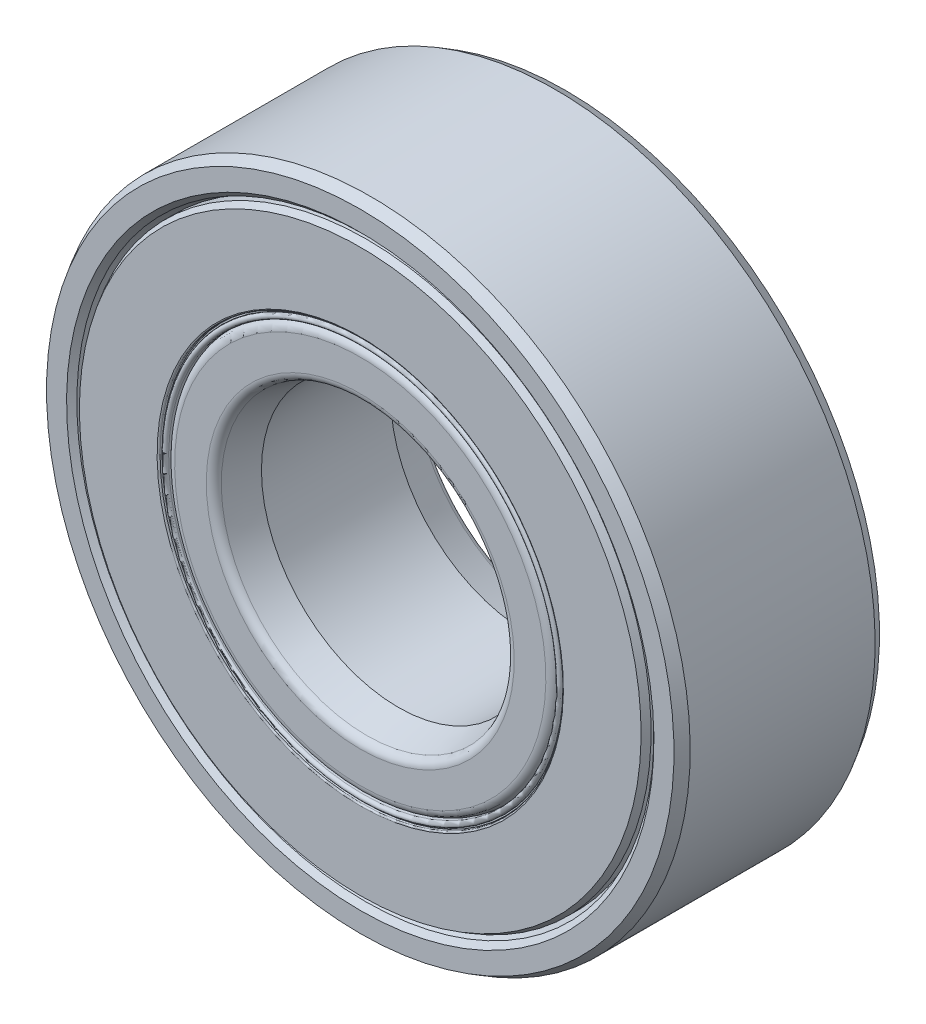
ISO-10303-21;
HEADER;
FILE_DESCRIPTION(('STEP AP214'),'2;1');
FILE_NAME('part.step','',(''),(''),'','','');
FILE_SCHEMA(('AUTOMOTIVE_DESIGN { 1 0 10303 214 1 1 1 1 }'));
ENDSEC;
DATA;
#1=APPLICATION_CONTEXT('core data for automotive mechanical design processes');
#2=APPLICATION_PROTOCOL_DEFINITION('international standard','automotive_design',2000,#1);
#3=PRODUCT_CONTEXT('',#1,'mechanical');
#4=PRODUCT('Part','Part','',(#3));
#5=PRODUCT_RELATED_PRODUCT_CATEGORY('part','',(#4));
#6=PRODUCT_DEFINITION_FORMATION('','',#4);
#7=PRODUCT_DEFINITION_CONTEXT('part definition',#1,'design');
#8=PRODUCT_DEFINITION('design','',#6,#7);
#9=PRODUCT_DEFINITION_SHAPE('','',#8);
#10=(LENGTH_UNIT() NAMED_UNIT(*) SI_UNIT(.MILLI.,.METRE.));
#11=(NAMED_UNIT(*) PLANE_ANGLE_UNIT() SI_UNIT($,.RADIAN.));
#12=(NAMED_UNIT(*) SI_UNIT($,.STERADIAN.) SOLID_ANGLE_UNIT());
#13=UNCERTAINTY_MEASURE_WITH_UNIT(LENGTH_MEASURE(1.E-05),#10,'distance_accuracy_value','');
#14=(GEOMETRIC_REPRESENTATION_CONTEXT(3) GLOBAL_UNCERTAINTY_ASSIGNED_CONTEXT((#13)) GLOBAL_UNIT_ASSIGNED_CONTEXT((#10,
#11,#12)) REPRESENTATION_CONTEXT('',''));
#15=CARTESIAN_POINT('',(0.,0.,0.));
#16=DIRECTION('',(0.,0.,1.));
#17=DIRECTION('',(1.,0.,0.));
#18=AXIS2_PLACEMENT_3D('',#15,#16,#17);
#19=CARTESIAN_POINT('',(0.,6.75745833333334,2.38125));
#20=DIRECTION('',(0.,0.,1.));
#21=DIRECTION('',(0.,-1.,0.));
#22=AXIS2_PLACEMENT_3D('',#19,#20,#21);
#23=PLANE('',#22);
#24=CARTESIAN_POINT('',(0.,0.,2.38125));
#25=DIRECTION('',(0.,0.,1.));
#26=DIRECTION('',(0.,-1.,0.));
#27=AXIS2_PLACEMENT_3D('',#24,#25,#26);
#28=CIRCLE('',#27,7.01145833333334);
#29=CARTESIAN_POINT('',(0.,-7.01145833333334,2.38125));
#30=VERTEX_POINT('',#29);
#31=EDGE_CURVE('E11',#30,#30,#28,.T.);
#32=ORIENTED_EDGE('',*,*,#31,.F.);
#33=EDGE_LOOP('',(#32));
#34=FACE_BOUND('',#33,.T.);
#35=CARTESIAN_POINT('',(0.,0.,2.38125));
#36=DIRECTION('',(0.,0.,1.));
#37=DIRECTION('',(0.,-1.,0.));
#38=AXIS2_PLACEMENT_3D('',#35,#36,#37);
#39=CIRCLE('',#38,6.75745833333334);
#40=CARTESIAN_POINT('',(0.,-6.75745833333334,2.38125));
#41=VERTEX_POINT('',#40);
#42=EDGE_CURVE('E76',#41,#41,#39,.T.);
#43=ORIENTED_EDGE('',*,*,#42,.T.);
#44=EDGE_LOOP('',(#43));
#45=FACE_BOUND('',#44,.T.);
#46=ADVANCED_FACE('F51',(#34,#45),#23,.F.);
#47=CARTESIAN_POINT('',(0.,0.,3.571875));
#48=DIRECTION('',(0.,0.,1.));
#49=DIRECTION('',(0.,-1.,0.));
#50=AXIS2_PLACEMENT_3D('',#47,#48,#49);
#51=CYLINDRICAL_SURFACE('',#50,7.01145833333334);
#52=CARTESIAN_POINT('',(0.,0.,3.3936805301339));
#53=DIRECTION('',(0.,0.,1.));
#54=DIRECTION('',(0.,-1.,0.));
#55=AXIS2_PLACEMENT_3D('',#52,#53,#54);
#56=CIRCLE('',#55,7.01145833333334);
#57=CARTESIAN_POINT('',(0.,-7.01145833333334,3.3936805301339));
#58=VERTEX_POINT('',#57);
#59=EDGE_CURVE('E57',#58,#58,#56,.T.);
#60=ORIENTED_EDGE('',*,*,#59,.F.);
#61=EDGE_LOOP('',(#60));
#62=FACE_BOUND('',#61,.T.);
#63=ORIENTED_EDGE('',*,*,#31,.T.);
#64=EDGE_LOOP('',(#63));
#65=FACE_BOUND('',#64,.T.);
#66=ADVANCED_FACE('F107',(#62,#65),#51,.T.);
#67=CARTESIAN_POINT('',(0.,0.,3.3936805301339));
#68=DIRECTION('',(0.,0.,-1.));
#69=DIRECTION('',(0.,1.,0.));
#70=AXIS2_PLACEMENT_3D('',#67,#68,#69);
#71=CONICAL_SURFACE('',#70,7.01145833333334,0.174532925199467);
#72=CARTESIAN_POINT('',(0.,0.,3.45621582245017));
#73=DIRECTION('',(0.,0.,1.));
#74=DIRECTION('',(0.,-1.,0.));
#75=AXIS2_PLACEMENT_3D('',#72,#73,#74);
#76=CIRCLE('',#75,7.00043167405148);
#77=CARTESIAN_POINT('',(0.,-7.00043167405148,3.45621582245017));
#78=VERTEX_POINT('',#77);
#79=EDGE_CURVE('E61',#78,#78,#76,.T.);
#80=ORIENTED_EDGE('',*,*,#79,.F.);
#81=EDGE_LOOP('',(#80));
#82=FACE_BOUND('',#81,.T.);
#83=ORIENTED_EDGE('',*,*,#59,.T.);
#84=EDGE_LOOP('',(#83));
#85=FACE_BOUND('',#84,.T.);
#86=ADVANCED_FACE('F102',(#82,#85),#71,.T.);
#87=CARTESIAN_POINT('',(0.,0.,3.451625));
#88=DIRECTION('',(0.,0.,1.));
#89=DIRECTION('',(0.,-1.,0.));
#90=AXIS2_PLACEMENT_3D('',#87,#88,#89);
#91=TOROIDAL_SURFACE('',#90,6.97439582615274,0.0264374928193996);
#92=CARTESIAN_POINT('',(0.,0.,3.451625));
#93=DIRECTION('',(0.,0.,1.));
#94=DIRECTION('',(0.,-1.,0.));
#95=AXIS2_PLACEMENT_3D('',#92,#93,#94);
#96=CIRCLE('',#95,6.94795833333334);
#97=CARTESIAN_POINT('',(0.,-6.94795833333334,3.451625));
#98=VERTEX_POINT('',#97);
#99=EDGE_CURVE('E65',#98,#98,#96,.T.);
#100=ORIENTED_EDGE('',*,*,#99,.F.);
#101=EDGE_LOOP('',(#100));
#102=FACE_BOUND('',#101,.T.);
#103=ORIENTED_EDGE('',*,*,#79,.T.);
#104=EDGE_LOOP('',(#103));
#105=FACE_BOUND('',#104,.T.);
#106=ADVANCED_FACE('F96',(#102,#105),#91,.T.);
#107=CARTESIAN_POINT('',(0.,0.,3.571875));
#108=DIRECTION('',(0.,0.,1.));
#109=DIRECTION('',(0.,-1.,0.));
#110=AXIS2_PLACEMENT_3D('',#107,#108,#109);
#111=CYLINDRICAL_SURFACE('',#110,6.94795833333334);
#112=CARTESIAN_POINT('',(0.,0.,3.476625));
#113=DIRECTION('',(0.,0.,1.));
#114=DIRECTION('',(0.,-1.,0.));
#115=AXIS2_PLACEMENT_3D('',#112,#113,#114);
#116=CIRCLE('',#115,6.94795833333334);
#117=CARTESIAN_POINT('',(0.,-6.94795833333334,3.476625));
#118=VERTEX_POINT('',#117);
#119=EDGE_CURVE('E70',#118,#118,#116,.T.);
#120=ORIENTED_EDGE('',*,*,#119,.F.);
#121=EDGE_LOOP('',(#120));
#122=FACE_BOUND('',#121,.T.);
#123=ORIENTED_EDGE('',*,*,#99,.T.);
#124=EDGE_LOOP('',(#123));
#125=FACE_BOUND('',#124,.T.);
#126=ADVANCED_FACE('F90',(#122,#125),#111,.T.);
#127=CARTESIAN_POINT('',(0.,0.,3.476625));
#128=DIRECTION('',(0.,0.,1.));
#129=DIRECTION('',(0.,-1.,0.));
#130=AXIS2_PLACEMENT_3D('',#127,#128,#129);
#131=TOROIDAL_SURFACE('',#130,6.85270833333334,0.0952499999999998);
#132=CARTESIAN_POINT('',(0.,0.,3.476625));
#133=DIRECTION('',(0.,0.,1.));
#134=DIRECTION('',(0.,-1.,0.));
#135=AXIS2_PLACEMENT_3D('',#132,#133,#134);
#136=CIRCLE('',#135,6.75745833333334);
#137=CARTESIAN_POINT('',(0.,-6.75745833333334,3.476625));
#138=VERTEX_POINT('',#137);
#139=EDGE_CURVE('E73',#138,#138,#136,.T.);
#140=ORIENTED_EDGE('',*,*,#139,.F.);
#141=EDGE_LOOP('',(#140));
#142=FACE_BOUND('',#141,.T.);
#143=ORIENTED_EDGE('',*,*,#119,.T.);
#144=EDGE_LOOP('',(#143));
#145=FACE_BOUND('',#144,.T.);
#146=ADVANCED_FACE('F84',(#142,#145),#131,.T.);
#147=CARTESIAN_POINT('',(0.,0.,3.571875));
#148=DIRECTION('',(0.,0.,1.));
#149=DIRECTION('',(0.,-1.,0.));
#150=AXIS2_PLACEMENT_3D('',#147,#148,#149);
#151=CYLINDRICAL_SURFACE('',#150,6.75745833333334);
#152=ORIENTED_EDGE('',*,*,#42,.F.);
#153=EDGE_LOOP('',(#152));
#154=FACE_BOUND('',#153,.T.);
#155=ORIENTED_EDGE('',*,*,#139,.T.);
#156=EDGE_LOOP('',(#155));
#157=FACE_BOUND('',#156,.T.);
#158=ADVANCED_FACE('F81',(#154,#157),#151,.F.);
#159=CLOSED_SHELL('',(#46,#66,#86,#106,#126,#146,#158));
#160=MANIFOLD_SOLID_BREP('B2',#159);
#161=CARTESIAN_POINT('',(0.,0.,-3.571875));
#162=DIRECTION('',(0.,0.,1.));
#163=DIRECTION('',(0.,-1.,0.));
#164=AXIS2_PLACEMENT_3D('',#161,#162,#163);
#165=CONICAL_SURFACE('',#164,9.763125,0.523598775598295);
#166=CARTESIAN_POINT('',(0.,0.,-3.35190454743876));
#167=DIRECTION('',(0.,0.,1.));
#168=DIRECTION('',(0.,-1.,0.));
#169=AXIS2_PLACEMENT_3D('',#166,#167,#168);
#170=CIRCLE('',#169,9.890125);
#171=CARTESIAN_POINT('',(0.,-9.890125,-3.35190454743876));
#172=VERTEX_POINT('',#171);
#173=EDGE_CURVE('E187',#172,#172,#170,.T.);
#174=ORIENTED_EDGE('',*,*,#173,.F.);
#175=EDGE_LOOP('',(#174));
#176=FACE_BOUND('',#175,.T.);
#177=CARTESIAN_POINT('',(0.,0.,-3.571875));
#178=DIRECTION('',(0.,0.,1.));
#179=DIRECTION('',(0.,-1.,0.));
#180=AXIS2_PLACEMENT_3D('',#177,#178,#179);
#181=CIRCLE('',#180,9.763125);
#182=CARTESIAN_POINT('',(0.,-9.763125,-3.57187500000001));
#183=VERTEX_POINT('',#182);
#184=EDGE_CURVE('E50',#183,#183,#181,.T.);
#185=ORIENTED_EDGE('',*,*,#184,.T.);
#186=EDGE_LOOP('',(#185));
#187=FACE_BOUND('',#186,.T.);
#188=ADVANCED_FACE('F165',(#176,#187),#165,.T.);
#189=CARTESIAN_POINT('',(0.,9.763125,-3.571875));
#190=DIRECTION('',(0.,0.,1.));
#191=DIRECTION('',(0.,-1.,0.));
#192=AXIS2_PLACEMENT_3D('',#189,#190,#191);
#193=PLANE('',#192);
#194=ORIENTED_EDGE('',*,*,#184,.F.);
#195=EDGE_LOOP('',(#194));
#196=FACE_BOUND('',#195,.T.);
#197=CARTESIAN_POINT('',(0.,0.,-3.57187500000001));
#198=DIRECTION('',(0.,0.,1.));
#199=DIRECTION('',(0.,-1.,0.));
#200=AXIS2_PLACEMENT_3D('',#197,#198,#199);
#201=CIRCLE('',#200,7.06225833333334);
#202=CARTESIAN_POINT('',(0.,-7.06225833333333,-3.57187500000001));
#203=VERTEX_POINT('',#202);
#204=EDGE_CURVE('E171',#203,#203,#201,.T.);
#205=ORIENTED_EDGE('',*,*,#204,.T.);
#206=EDGE_LOOP('',(#205));
#207=FACE_BOUND('',#206,.T.);
#208=ADVANCED_FACE('F194',(#196,#207),#193,.F.);
#209=CARTESIAN_POINT('',(0.,0.,-3.521075));
#210=DIRECTION('',(0.,0.,1.));
#211=DIRECTION('',(0.,-1.,0.));
#212=AXIS2_PLACEMENT_3D('',#209,#210,#211);
#213=TOROIDAL_SURFACE('',#212,7.06225833333334,0.0508000000000004);
#214=ORIENTED_EDGE('',*,*,#204,.F.);
#215=EDGE_LOOP('',(#214));
#216=FACE_BOUND('',#215,.T.);
#217=CARTESIAN_POINT('',(0.,0.,-3.521075));
#218=DIRECTION('',(0.,0.,1.));
#219=DIRECTION('',(0.,-1.,0.));
#220=AXIS2_PLACEMENT_3D('',#217,#218,#219);
#221=CIRCLE('',#220,7.01145833333333);
#222=CARTESIAN_POINT('',(0.,-7.01145833333333,-3.52107500000001));
#223=VERTEX_POINT('',#222);
#224=EDGE_CURVE('E175',#223,#223,#221,.T.);
#225=ORIENTED_EDGE('',*,*,#224,.T.);
#226=EDGE_LOOP('',(#225));
#227=FACE_BOUND('',#226,.T.);
#228=ADVANCED_FACE('F198',(#216,#227),#213,.T.);
#229=CARTESIAN_POINT('',(0.,0.,3.571875));
#230=DIRECTION('',(0.,0.,1.));
#231=DIRECTION('',(0.,-1.,0.));
#232=AXIS2_PLACEMENT_3D('',#229,#230,#231);
#233=CYLINDRICAL_SURFACE('',#232,7.01145833333333);
#234=ORIENTED_EDGE('',*,*,#224,.F.);
#235=EDGE_LOOP('',(#234));
#236=FACE_BOUND('',#235,.T.);
#237=CARTESIAN_POINT('',(0.,0.,-2.38125));
#238=DIRECTION('',(0.,0.,1.));
#239=DIRECTION('',(0.,-1.,0.));
#240=AXIS2_PLACEMENT_3D('',#237,#238,#239);
#241=CIRCLE('',#240,7.01145833333334);
#242=CARTESIAN_POINT('',(0.,-7.01145833333333,-2.38125));
#243=VERTEX_POINT('',#242);
#244=EDGE_CURVE('E179',#243,#243,#241,.T.);
#245=ORIENTED_EDGE('',*,*,#244,.T.);
#246=EDGE_LOOP('',(#245));
#247=FACE_BOUND('',#246,.T.);
#248=ADVANCED_FACE('F203',(#236,#247),#233,.F.);
#249=CARTESIAN_POINT('',(0.,9.890125,-2.38125));
#250=DIRECTION('',(0.,0.,-1.));
#251=DIRECTION('',(0.,1.,0.));
#252=AXIS2_PLACEMENT_3D('',#249,#250,#251);
#253=PLANE('',#252);
#254=ORIENTED_EDGE('',*,*,#244,.F.);
#255=EDGE_LOOP('',(#254));
#256=FACE_BOUND('',#255,.T.);
#257=CARTESIAN_POINT('',(0.,0.,-2.38125));
#258=DIRECTION('',(0.,0.,1.));
#259=DIRECTION('',(0.,-1.,0.));
#260=AXIS2_PLACEMENT_3D('',#257,#258,#259);
#261=CIRCLE('',#260,9.890125);
#262=CARTESIAN_POINT('',(0.,-9.890125,-2.38125));
#263=VERTEX_POINT('',#262);
#264=EDGE_CURVE('E184',#263,#263,#261,.T.);
#265=ORIENTED_EDGE('',*,*,#264,.T.);
#266=EDGE_LOOP('',(#265));
#267=FACE_BOUND('',#266,.T.);
#268=ADVANCED_FACE('F209',(#256,#267),#253,.F.);
#269=CARTESIAN_POINT('',(0.,0.,3.571875));
#270=DIRECTION('',(0.,0.,1.));
#271=DIRECTION('',(0.,-1.,0.));
#272=AXIS2_PLACEMENT_3D('',#269,#270,#271);
#273=CYLINDRICAL_SURFACE('',#272,9.890125);
#274=ORIENTED_EDGE('',*,*,#264,.F.);
#275=EDGE_LOOP('',(#274));
#276=FACE_BOUND('',#275,.T.);
#277=ORIENTED_EDGE('',*,*,#173,.T.);
#278=EDGE_LOOP('',(#277));
#279=FACE_BOUND('',#278,.T.);
#280=ADVANCED_FACE('F191',(#276,#279),#273,.T.);
#281=CLOSED_SHELL('',(#188,#208,#228,#248,#268,#280));
#282=MANIFOLD_SOLID_BREP('B6',#281);
#283=CARTESIAN_POINT('',(0.,9.890125,2.38125));
#284=DIRECTION('',(0.,0.,1.));
#285=DIRECTION('',(0.,-1.,0.));
#286=AXIS2_PLACEMENT_3D('',#283,#284,#285);
#287=PLANE('',#286);
#288=CARTESIAN_POINT('',(0.,0.,2.38125));
#289=DIRECTION('',(0.,0.,1.));
#290=DIRECTION('',(0.,-1.,0.));
#291=AXIS2_PLACEMENT_3D('',#288,#289,#290);
#292=CIRCLE('',#291,9.890125);
#293=CARTESIAN_POINT('',(0.,-9.890125,2.38125));
#294=VERTEX_POINT('',#293);
#295=EDGE_CURVE('E164',#294,#294,#292,.T.);
#296=ORIENTED_EDGE('',*,*,#295,.F.);
#297=EDGE_LOOP('',(#296));
#298=FACE_BOUND('',#297,.T.);
#299=CARTESIAN_POINT('',(0.,0.,2.38125));
#300=DIRECTION('',(0.,0.,1.));
#301=DIRECTION('',(0.,-1.,0.));
#302=AXIS2_PLACEMENT_3D('',#299,#300,#301);
#303=CIRCLE('',#302,7.01145833333334);
#304=CARTESIAN_POINT('',(0.,-7.01145833333334,2.38125));
#305=VERTEX_POINT('',#304);
#306=EDGE_CURVE('E284',#305,#305,#303,.T.);
#307=ORIENTED_EDGE('',*,*,#306,.T.);
#308=EDGE_LOOP('',(#307));
#309=FACE_BOUND('',#308,.T.);
#310=ADVANCED_FACE('F262',(#298,#309),#287,.F.);
#311=CARTESIAN_POINT('',(0.,0.,3.571875));
#312=DIRECTION('',(0.,0.,1.));
#313=DIRECTION('',(0.,-1.,0.));
#314=AXIS2_PLACEMENT_3D('',#311,#312,#313);
#315=CYLINDRICAL_SURFACE('',#314,9.890125);
#316=CARTESIAN_POINT('',(0.,0.,3.35190454743875));
#317=DIRECTION('',(0.,0.,1.));
#318=DIRECTION('',(0.,-1.,0.));
#319=AXIS2_PLACEMENT_3D('',#316,#317,#318);
#320=CIRCLE('',#319,9.890125);
#321=CARTESIAN_POINT('',(0.,-9.890125,3.35190454743875));
#322=VERTEX_POINT('',#321);
#323=EDGE_CURVE('E268',#322,#322,#320,.T.);
#324=ORIENTED_EDGE('',*,*,#323,.F.);
#325=EDGE_LOOP('',(#324));
#326=FACE_BOUND('',#325,.T.);
#327=ORIENTED_EDGE('',*,*,#295,.T.);
#328=EDGE_LOOP('',(#327));
#329=FACE_BOUND('',#328,.T.);
#330=ADVANCED_FACE('F309',(#326,#329),#315,.T.);
#331=CARTESIAN_POINT('',(0.,0.,3.35190454743875));
#332=DIRECTION('',(0.,0.,-1.));
#333=DIRECTION('',(0.,1.,0.));
#334=AXIS2_PLACEMENT_3D('',#331,#332,#333);
#335=CONICAL_SURFACE('',#334,9.890125,0.523598775598299);
#336=CARTESIAN_POINT('',(0.,0.,3.571875));
#337=DIRECTION('',(0.,0.,1.));
#338=DIRECTION('',(0.,-1.,0.));
#339=AXIS2_PLACEMENT_3D('',#336,#337,#338);
#340=CIRCLE('',#339,9.763125);
#341=CARTESIAN_POINT('',(0.,-9.763125,3.571875));
#342=VERTEX_POINT('',#341);
#343=EDGE_CURVE('E272',#342,#342,#340,.T.);
#344=ORIENTED_EDGE('',*,*,#343,.F.);
#345=EDGE_LOOP('',(#344));
#346=FACE_BOUND('',#345,.T.);
#347=ORIENTED_EDGE('',*,*,#323,.T.);
#348=EDGE_LOOP('',(#347));
#349=FACE_BOUND('',#348,.T.);
#350=ADVANCED_FACE('F304',(#346,#349),#335,.T.);
#351=CARTESIAN_POINT('',(0.,9.763125,3.571875));
#352=DIRECTION('',(0.,0.,-1.));
#353=DIRECTION('',(0.,1.,0.));
#354=AXIS2_PLACEMENT_3D('',#351,#352,#353);
#355=PLANE('',#354);
#356=CARTESIAN_POINT('',(0.,0.,3.571875));
#357=DIRECTION('',(0.,0.,1.));
#358=DIRECTION('',(0.,-1.,0.));
#359=AXIS2_PLACEMENT_3D('',#356,#357,#358);
#360=CIRCLE('',#359,7.06225833333334);
#361=CARTESIAN_POINT('',(0.,-7.06225833333334,3.571875));
#362=VERTEX_POINT('',#361);
#363=EDGE_CURVE('E276',#362,#362,#360,.T.);
#364=ORIENTED_EDGE('',*,*,#363,.F.);
#365=EDGE_LOOP('',(#364));
#366=FACE_BOUND('',#365,.T.);
#367=ORIENTED_EDGE('',*,*,#343,.T.);
#368=EDGE_LOOP('',(#367));
#369=FACE_BOUND('',#368,.T.);
#370=ADVANCED_FACE('F298',(#366,#369),#355,.F.);
#371=CARTESIAN_POINT('',(0.,0.,3.521075));
#372=DIRECTION('',(0.,0.,1.));
#373=DIRECTION('',(0.,-1.,0.));
#374=AXIS2_PLACEMENT_3D('',#371,#372,#373);
#375=TOROIDAL_SURFACE('',#374,7.06225833333334,0.0508000000000004);
#376=CARTESIAN_POINT('',(0.,0.,3.521075));
#377=DIRECTION('',(0.,0.,1.));
#378=DIRECTION('',(0.,-1.,0.));
#379=AXIS2_PLACEMENT_3D('',#376,#377,#378);
#380=CIRCLE('',#379,7.01145833333334);
#381=CARTESIAN_POINT('',(0.,-7.01145833333334,3.521075));
#382=VERTEX_POINT('',#381);
#383=EDGE_CURVE('E281',#382,#382,#380,.T.);
#384=ORIENTED_EDGE('',*,*,#383,.F.);
#385=EDGE_LOOP('',(#384));
#386=FACE_BOUND('',#385,.T.);
#387=ORIENTED_EDGE('',*,*,#363,.T.);
#388=EDGE_LOOP('',(#387));
#389=FACE_BOUND('',#388,.T.);
#390=ADVANCED_FACE('F292',(#386,#389),#375,.T.);
#391=CARTESIAN_POINT('',(0.,0.,3.571875));
#392=DIRECTION('',(0.,0.,1.));
#393=DIRECTION('',(0.,-1.,0.));
#394=AXIS2_PLACEMENT_3D('',#391,#392,#393);
#395=CYLINDRICAL_SURFACE('',#394,7.01145833333334);
#396=ORIENTED_EDGE('',*,*,#306,.F.);
#397=EDGE_LOOP('',(#396));
#398=FACE_BOUND('',#397,.T.);
#399=ORIENTED_EDGE('',*,*,#383,.T.);
#400=EDGE_LOOP('',(#399));
#401=FACE_BOUND('',#400,.T.);
#402=ADVANCED_FACE('F289',(#398,#401),#395,.F.);
#403=CLOSED_SHELL('',(#310,#330,#350,#370,#390,#402));
#404=MANIFOLD_SOLID_BREP('B45',#403);
#405=CARTESIAN_POINT('',(-5.885809532684,5.88580953268415,0.));
#406=DIRECTION('',(0.,0.,1.));
#407=DIRECTION('',(-0.707106781186539,0.707106781186556,0.));
#408=AXIS2_PLACEMENT_3D('',#405,#406,#407);
#409=SPHERICAL_SURFACE('',#408,2.38125);
#410=CARTESIAN_POINT('',(-5.885809532684,5.88580953268415,2.38125));
#411=VERTEX_POINT('',#410);
#412=VERTEX_LOOP('',#411);
#413=FACE_BOUND('',#412,.T.);
#414=ADVANCED_FACE('F381',(#413),#409,.T.);
#415=CLOSED_SHELL('',(#414));
#416=MANIFOLD_SOLID_BREP('B159',#415);
#417=CARTESIAN_POINT('',(-8.32379166666667,0.,0.));
#418=DIRECTION('',(0.,0.,1.));
#419=DIRECTION('',(-1.,0.,0.));
#420=AXIS2_PLACEMENT_3D('',#417,#418,#419);
#421=SPHERICAL_SURFACE('',#420,2.38125);
#422=CARTESIAN_POINT('',(-8.32379166666667,0.,2.38125));
#423=VERTEX_POINT('',#422);
#424=VERTEX_LOOP('',#423);
#425=FACE_BOUND('',#424,.T.);
#426=ADVANCED_FACE('F399',(#425),#421,.T.);
#427=CLOSED_SHELL('',(#426));
#428=MANIFOLD_SOLID_BREP('B258',#427);
#429=CARTESIAN_POINT('',(-5.88580953268413,-5.88580953268402,0.));
#430=DIRECTION('',(0.,0.,1.));
#431=DIRECTION('',(-0.707106781186554,-0.707106781186541,0.));
#432=AXIS2_PLACEMENT_3D('',#429,#430,#431);
#433=SPHERICAL_SURFACE('',#432,2.38125);
#434=CARTESIAN_POINT('',(-5.88580953268413,-5.88580953268402,2.38125));
#435=VERTEX_POINT('',#434);
#436=VERTEX_LOOP('',#435);
#437=FACE_BOUND('',#436,.T.);
#438=ADVANCED_FACE('F417',(#437),#433,.T.);
#439=CLOSED_SHELL('',(#438));
#440=MANIFOLD_SOLID_BREP('B377',#439);
#441=CARTESIAN_POINT('',(0.,-8.32379166666667,0.));
#442=DIRECTION('',(0.,0.,1.));
#443=DIRECTION('',(0.,-1.,0.));
#444=AXIS2_PLACEMENT_3D('',#441,#442,#443);
#445=SPHERICAL_SURFACE('',#444,2.38125);
#446=CARTESIAN_POINT('',(0.,-8.32379166666667,2.38124999999999));
#447=VERTEX_POINT('',#446);
#448=VERTEX_LOOP('',#447);
#449=FACE_BOUND('',#448,.T.);
#450=ADVANCED_FACE('F435',(#449),#445,.T.);
#451=CLOSED_SHELL('',(#450));
#452=MANIFOLD_SOLID_BREP('B395',#451);
#453=CARTESIAN_POINT('',(5.88580953268404,-5.88580953268411,0.));
#454=DIRECTION('',(0.,0.,1.));
#455=DIRECTION('',(0.707106781186544,-0.707106781186551,0.));
#456=AXIS2_PLACEMENT_3D('',#453,#454,#455);
#457=SPHERICAL_SURFACE('',#456,2.38125);
#458=CARTESIAN_POINT('',(5.88580953268404,-5.88580953268411,2.38125));
#459=VERTEX_POINT('',#458);
#460=VERTEX_LOOP('',#459);
#461=FACE_BOUND('',#460,.T.);
#462=ADVANCED_FACE('F453',(#461),#457,.T.);
#463=CLOSED_SHELL('',(#462));
#464=MANIFOLD_SOLID_BREP('B413',#463);
#465=CARTESIAN_POINT('',(8.32379166666667,0.,0.));
#466=DIRECTION('',(0.,0.,1.));
#467=DIRECTION('',(1.,0.,0.));
#468=AXIS2_PLACEMENT_3D('',#465,#466,#467);
#469=SPHERICAL_SURFACE('',#468,2.38125);
#470=CARTESIAN_POINT('',(8.32379166666667,0.,2.38125));
#471=VERTEX_POINT('',#470);
#472=VERTEX_LOOP('',#471);
#473=FACE_BOUND('',#472,.T.);
#474=ADVANCED_FACE('F471',(#473),#469,.T.);
#475=CLOSED_SHELL('',(#474));
#476=MANIFOLD_SOLID_BREP('B431',#475);
#477=CARTESIAN_POINT('',(5.88580953268408,5.88580953268406,0.));
#478=DIRECTION('',(0.,0.,1.));
#479=DIRECTION('',(0.707106781186549,0.707106781186546,0.));
#480=AXIS2_PLACEMENT_3D('',#477,#478,#479);
#481=SPHERICAL_SURFACE('',#480,2.38125);
#482=CARTESIAN_POINT('',(5.88580953268408,5.88580953268406,2.38125));
#483=VERTEX_POINT('',#482);
#484=VERTEX_LOOP('',#483);
#485=FACE_BOUND('',#484,.T.);
#486=ADVANCED_FACE('F489',(#485),#481,.T.);
#487=CLOSED_SHELL('',(#486));
#488=MANIFOLD_SOLID_BREP('B449',#487);
#489=CARTESIAN_POINT('',(0.,8.32379166666667,0.));
#490=DIRECTION('',(0.,0.,1.));
#491=DIRECTION('',(0.,1.,0.));
#492=AXIS2_PLACEMENT_3D('',#489,#490,#491);
#493=SPHERICAL_SURFACE('',#492,2.38125);
#494=CARTESIAN_POINT('',(0.,8.32379166666667,2.38125));
#495=VERTEX_POINT('',#494);
#496=VERTEX_LOOP('',#495);
#497=FACE_BOUND('',#496,.T.);
#498=ADVANCED_FACE('F509',(#497),#493,.T.);
#499=CLOSED_SHELL('',(#498));
#500=MANIFOLD_SOLID_BREP('B467',#499);
#501=CARTESIAN_POINT('',(0.,0.,-3.26645774265215));
#502=DIRECTION('',(0.,0.,1.));
#503=DIRECTION('',(0.,-1.,0.));
#504=AXIS2_PLACEMENT_3D('',#501,#502,#503);
#505=TOROIDAL_SURFACE('',#504,5.35252083333333,0.305417257347854);
#506=CARTESIAN_POINT('',(0.,0.,-3.571875));
#507=DIRECTION('',(0.,0.,1.));
#508=DIRECTION('',(0.,-1.,0.));
#509=AXIS2_PLACEMENT_3D('',#506,#507,#508);
#510=CIRCLE('',#509,5.35252083333333);
#511=CARTESIAN_POINT('',(0.,-5.35252083333333,-3.571875));
#512=VERTEX_POINT('',#511);
#513=EDGE_CURVE('E508',#512,#512,#510,.T.);
#514=ORIENTED_EDGE('',*,*,#513,.F.);
#515=EDGE_LOOP('',(#514));
#516=FACE_BOUND('',#515,.T.);
#517=CARTESIAN_POINT('',(0.,0.,-3.34550554555675));
#518=DIRECTION('',(0.,0.,1.));
#519=DIRECTION('',(0.,-1.,0.));
#520=AXIS2_PLACEMENT_3D('',#517,#518,#519);
#521=CIRCLE('',#520,5.05751041666667);
#522=CARTESIAN_POINT('',(0.,-5.05751041666667,-3.34550554555675));
#523=VERTEX_POINT('',#522);
#524=EDGE_CURVE('E568',#523,#523,#521,.T.);
#525=ORIENTED_EDGE('',*,*,#524,.T.);
#526=EDGE_LOOP('',(#525));
#527=FACE_BOUND('',#526,.T.);
#528=ADVANCED_FACE('F528',(#516,#527),#505,.T.);
#529=CARTESIAN_POINT('',(0.,5.35252083333333,-3.571875));
#530=DIRECTION('',(0.,0.,1.));
#531=DIRECTION('',(0.,-1.,0.));
#532=AXIS2_PLACEMENT_3D('',#529,#530,#531);
#533=PLANE('',#532);
#534=CARTESIAN_POINT('',(0.,0.,-3.571875));
#535=DIRECTION('',(0.,0.,1.));
#536=DIRECTION('',(0.,-1.,0.));
#537=AXIS2_PLACEMENT_3D('',#534,#535,#536);
#538=CIRCLE('',#537,6.45204107598548);
#539=CARTESIAN_POINT('',(0.,-6.45204107598548,-3.571875));
#540=VERTEX_POINT('',#539);
#541=EDGE_CURVE('E534',#540,#540,#538,.T.);
#542=ORIENTED_EDGE('',*,*,#541,.F.);
#543=EDGE_LOOP('',(#542));
#544=FACE_BOUND('',#543,.T.);
#545=ORIENTED_EDGE('',*,*,#513,.T.);
#546=EDGE_LOOP('',(#545));
#547=FACE_BOUND('',#546,.T.);
#548=ADVANCED_FACE('F629',(#544,#547),#533,.F.);
#549=CARTESIAN_POINT('',(0.,0.,-3.26645774265215));
#550=DIRECTION('',(0.,0.,1.));
#551=DIRECTION('',(0.,-1.,0.));
#552=AXIS2_PLACEMENT_3D('',#549,#550,#551);
#553=TOROIDAL_SURFACE('',#552,6.45204107598548,0.305417257347853);
#554=CARTESIAN_POINT('',(0.,0.,-3.26645774265215));
#555=DIRECTION('',(0.,0.,1.));
#556=DIRECTION('',(0.,-1.,0.));
#557=AXIS2_PLACEMENT_3D('',#554,#555,#556);
#558=CIRCLE('',#557,6.75745833333333);
#559=CARTESIAN_POINT('',(0.,-6.75745833333333,-3.26645774265215));
#560=VERTEX_POINT('',#559);
#561=EDGE_CURVE('E538',#560,#560,#558,.T.);
#562=ORIENTED_EDGE('',*,*,#561,.F.);
#563=EDGE_LOOP('',(#562));
#564=FACE_BOUND('',#563,.T.);
#565=ORIENTED_EDGE('',*,*,#541,.T.);
#566=EDGE_LOOP('',(#565));
#567=FACE_BOUND('',#566,.T.);
#568=ADVANCED_FACE('F624',(#564,#567),#553,.T.);
#569=CARTESIAN_POINT('',(0.,0.,3.571875));
#570=DIRECTION('',(0.,0.,1.));
#571=DIRECTION('',(0.,-1.,0.));
#572=AXIS2_PLACEMENT_3D('',#569,#570,#571);
#573=CYLINDRICAL_SURFACE('',#572,6.75745833333334);
#574=CARTESIAN_POINT('',(0.,0.,-1.79358619848306));
#575=DIRECTION('',(0.,0.,1.));
#576=DIRECTION('',(0.,-1.,0.));
#577=AXIS2_PLACEMENT_3D('',#574,#575,#576);
#578=CIRCLE('',#577,6.75745833333334);
#579=CARTESIAN_POINT('',(0.,-6.75745833333334,-1.79358619848306));
#580=VERTEX_POINT('',#579);
#581=EDGE_CURVE('E542',#580,#580,#578,.T.);
#582=ORIENTED_EDGE('',*,*,#581,.F.);
#583=EDGE_LOOP('',(#582));
#584=FACE_BOUND('',#583,.T.);
#585=ORIENTED_EDGE('',*,*,#561,.T.);
#586=EDGE_LOOP('',(#585));
#587=FACE_BOUND('',#586,.T.);
#588=ADVANCED_FACE('F618',(#584,#587),#573,.T.);
#589=CARTESIAN_POINT('',(0.,0.,0.));
#590=DIRECTION('',(0.,0.,1.));
#591=DIRECTION('',(0.,-1.,0.));
#592=AXIS2_PLACEMENT_3D('',#589,#590,#591);
#593=TOROIDAL_SURFACE('',#592,8.32379166666667,2.38125);
#594=CARTESIAN_POINT('',(0.,0.,1.79358619848305));
#595=DIRECTION('',(0.,0.,1.));
#596=DIRECTION('',(0.,-1.,0.));
#597=AXIS2_PLACEMENT_3D('',#594,#595,#596);
#598=CIRCLE('',#597,6.75745833333334);
#599=CARTESIAN_POINT('',(0.,-6.75745833333334,1.79358619848305));
#600=VERTEX_POINT('',#599);
#601=EDGE_CURVE('E547',#600,#600,#598,.T.);
#602=ORIENTED_EDGE('',*,*,#601,.F.);
#603=EDGE_LOOP('',(#602));
#604=FACE_BOUND('',#603,.T.);
#605=ORIENTED_EDGE('',*,*,#581,.T.);
#606=EDGE_LOOP('',(#605));
#607=FACE_BOUND('',#606,.T.);
#608=ADVANCED_FACE('F612',(#604,#607),#593,.F.);
#609=CARTESIAN_POINT('',(0.,0.,3.571875));
#610=DIRECTION('',(0.,0.,1.));
#611=DIRECTION('',(0.,-1.,0.));
#612=AXIS2_PLACEMENT_3D('',#609,#610,#611);
#613=CYLINDRICAL_SURFACE('',#612,6.75745833333334);
#614=CARTESIAN_POINT('',(0.,0.,3.26645774265215));
#615=DIRECTION('',(0.,0.,1.));
#616=DIRECTION('',(0.,-1.,0.));
#617=AXIS2_PLACEMENT_3D('',#614,#615,#616);
#618=CIRCLE('',#617,6.75745833333334);
#619=CARTESIAN_POINT('',(0.,-6.75745833333334,3.26645774265215));
#620=VERTEX_POINT('',#619);
#621=EDGE_CURVE('E550',#620,#620,#618,.T.);
#622=ORIENTED_EDGE('',*,*,#621,.F.);
#623=EDGE_LOOP('',(#622));
#624=FACE_BOUND('',#623,.T.);
#625=ORIENTED_EDGE('',*,*,#601,.T.);
#626=EDGE_LOOP('',(#625));
#627=FACE_BOUND('',#626,.T.);
#628=ADVANCED_FACE('F606',(#624,#627),#613,.T.);
#629=CARTESIAN_POINT('',(0.,0.,3.26645774265215));
#630=DIRECTION('',(0.,0.,1.));
#631=DIRECTION('',(0.,-1.,0.));
#632=AXIS2_PLACEMENT_3D('',#629,#630,#631);
#633=TOROIDAL_SURFACE('',#632,6.45204107598548,0.305417257347853);
#634=CARTESIAN_POINT('',(0.,0.,3.571875));
#635=DIRECTION('',(0.,0.,1.));
#636=DIRECTION('',(0.,-1.,0.));
#637=AXIS2_PLACEMENT_3D('',#634,#635,#636);
#638=CIRCLE('',#637,6.45204107598548);
#639=CARTESIAN_POINT('',(0.,-6.45204107598548,3.571875));
#640=VERTEX_POINT('',#639);
#641=EDGE_CURVE('E553',#640,#640,#638,.T.);
#642=ORIENTED_EDGE('',*,*,#641,.F.);
#643=EDGE_LOOP('',(#642));
#644=FACE_BOUND('',#643,.T.);
#645=ORIENTED_EDGE('',*,*,#621,.T.);
#646=EDGE_LOOP('',(#645));
#647=FACE_BOUND('',#646,.T.);
#648=ADVANCED_FACE('F600',(#644,#647),#633,.T.);
#649=CARTESIAN_POINT('',(0.,5.35252083333333,3.571875));
#650=DIRECTION('',(0.,0.,-1.));
#651=DIRECTION('',(0.,1.,0.));
#652=AXIS2_PLACEMENT_3D('',#649,#650,#651);
#653=PLANE('',#652);
#654=CARTESIAN_POINT('',(0.,0.,3.571875));
#655=DIRECTION('',(0.,0.,1.));
#656=DIRECTION('',(0.,-1.,0.));
#657=AXIS2_PLACEMENT_3D('',#654,#655,#656);
#658=CIRCLE('',#657,5.35252083333333);
#659=CARTESIAN_POINT('',(0.,-5.35252083333333,3.571875));
#660=VERTEX_POINT('',#659);
#661=EDGE_CURVE('E556',#660,#660,#658,.T.);
#662=ORIENTED_EDGE('',*,*,#661,.F.);
#663=EDGE_LOOP('',(#662));
#664=FACE_BOUND('',#663,.T.);
#665=ORIENTED_EDGE('',*,*,#641,.T.);
#666=EDGE_LOOP('',(#665));
#667=FACE_BOUND('',#666,.T.);
#668=ADVANCED_FACE('F594',(#664,#667),#653,.F.);
#669=CARTESIAN_POINT('',(0.,0.,3.26645774265215));
#670=DIRECTION('',(0.,0.,1.));
#671=DIRECTION('',(0.,-1.,0.));
#672=AXIS2_PLACEMENT_3D('',#669,#670,#671);
#673=TOROIDAL_SURFACE('',#672,5.35252083333333,0.305417257347854);
#674=CARTESIAN_POINT('',(0.,0.,3.34550554555675));
#675=DIRECTION('',(0.,0.,1.));
#676=DIRECTION('',(0.,-1.,0.));
#677=AXIS2_PLACEMENT_3D('',#674,#675,#676);
#678=CIRCLE('',#677,5.05751041666667);
#679=CARTESIAN_POINT('',(0.,-5.05751041666667,3.34550554555675));
#680=VERTEX_POINT('',#679);
#681=EDGE_CURVE('E559',#680,#680,#678,.T.);
#682=ORIENTED_EDGE('',*,*,#681,.F.);
#683=EDGE_LOOP('',(#682));
#684=FACE_BOUND('',#683,.T.);
#685=ORIENTED_EDGE('',*,*,#661,.T.);
#686=EDGE_LOOP('',(#685));
#687=FACE_BOUND('',#686,.T.);
#688=ADVANCED_FACE('F588',(#684,#687),#673,.T.);
#689=CARTESIAN_POINT('',(0.,0.,3.34550554555675));
#690=DIRECTION('',(0.,0.,1.));
#691=DIRECTION('',(0.,-1.,0.));
#692=AXIS2_PLACEMENT_3D('',#689,#690,#691);
#693=CONICAL_SURFACE('',#692,5.05751041666667,0.26179938779915);
#694=CARTESIAN_POINT('',(0.,0.,2.24451168179469));
#695=DIRECTION('',(0.,0.,1.));
#696=DIRECTION('',(0.,-1.,0.));
#697=AXIS2_PLACEMENT_3D('',#694,#695,#696);
#698=CIRCLE('',#697,4.7625);
#699=CARTESIAN_POINT('',(0.,-4.7625,2.24451168179469));
#700=VERTEX_POINT('',#699);
#701=EDGE_CURVE('E562',#700,#700,#698,.T.);
#702=ORIENTED_EDGE('',*,*,#701,.F.);
#703=EDGE_LOOP('',(#702));
#704=FACE_BOUND('',#703,.T.);
#705=ORIENTED_EDGE('',*,*,#681,.T.);
#706=EDGE_LOOP('',(#705));
#707=FACE_BOUND('',#706,.T.);
#708=ADVANCED_FACE('F582',(#704,#707),#693,.F.);
#709=CARTESIAN_POINT('',(0.,0.,3.571875));
#710=DIRECTION('',(0.,0.,1.));
#711=DIRECTION('',(0.,-1.,0.));
#712=AXIS2_PLACEMENT_3D('',#709,#710,#711);
#713=CYLINDRICAL_SURFACE('',#712,4.7625);
#714=CARTESIAN_POINT('',(0.,0.,-2.24451168179469));
#715=DIRECTION('',(0.,0.,1.));
#716=DIRECTION('',(0.,-1.,0.));
#717=AXIS2_PLACEMENT_3D('',#714,#715,#716);
#718=CIRCLE('',#717,4.7625);
#719=CARTESIAN_POINT('',(0.,-4.7625,-2.24451168179469));
#720=VERTEX_POINT('',#719);
#721=EDGE_CURVE('E565',#720,#720,#718,.T.);
#722=ORIENTED_EDGE('',*,*,#721,.F.);
#723=EDGE_LOOP('',(#722));
#724=FACE_BOUND('',#723,.T.);
#725=ORIENTED_EDGE('',*,*,#701,.T.);
#726=EDGE_LOOP('',(#725));
#727=FACE_BOUND('',#726,.T.);
#728=ADVANCED_FACE('F576',(#724,#727),#713,.F.);
#729=CARTESIAN_POINT('',(0.,0.,-2.24451168179469));
#730=DIRECTION('',(0.,0.,-1.));
#731=DIRECTION('',(0.,1.,0.));
#732=AXIS2_PLACEMENT_3D('',#729,#730,#731);
#733=CONICAL_SURFACE('',#732,4.7625,0.26179938779915);
#734=ORIENTED_EDGE('',*,*,#524,.F.);
#735=EDGE_LOOP('',(#734));
#736=FACE_BOUND('',#735,.T.);
#737=ORIENTED_EDGE('',*,*,#721,.T.);
#738=EDGE_LOOP('',(#737));
#739=FACE_BOUND('',#738,.T.);
#740=ADVANCED_FACE('F573',(#736,#739),#733,.F.);
#741=CLOSED_SHELL('',(#528,#548,#568,#588,#608,#628,#648,#668,#688,#708,#728,#740));
#742=MANIFOLD_SOLID_BREP('B485',#741);
#743=CARTESIAN_POINT('',(0.,0.,3.571875));
#744=DIRECTION('',(0.,0.,1.));
#745=DIRECTION('',(0.,-1.,0.));
#746=AXIS2_PLACEMENT_3D('',#743,#744,#745);
#747=CYLINDRICAL_SURFACE('',#746,9.890125);
#748=CARTESIAN_POINT('',(0.,0.,1.79358619848305));
#749=DIRECTION('',(0.,0.,1.));
#750=DIRECTION('',(0.,-1.,0.));
#751=AXIS2_PLACEMENT_3D('',#748,#749,#750);
#752=CIRCLE('',#751,9.890125);
#753=CARTESIAN_POINT('',(0.,-9.890125,1.79358619848305));
#754=VERTEX_POINT('',#753);
#755=EDGE_CURVE('E527',#754,#754,#752,.T.);
#756=ORIENTED_EDGE('',*,*,#755,.F.);
#757=EDGE_LOOP('',(#756));
#758=FACE_BOUND('',#757,.T.);
#759=CARTESIAN_POINT('',(0.,0.,3.00571010425736));
#760=DIRECTION('',(0.,0.,1.));
#761=DIRECTION('',(0.,-1.,0.));
#762=AXIS2_PLACEMENT_3D('',#759,#760,#761);
#763=CIRCLE('',#762,9.890125);
#764=CARTESIAN_POINT('',(0.,-9.890125,3.00571010425736));
#765=VERTEX_POINT('',#764);
#766=EDGE_CURVE('E763',#765,#765,#763,.T.);
#767=ORIENTED_EDGE('',*,*,#766,.T.);
#768=EDGE_LOOP('',(#767));
#769=FACE_BOUND('',#768,.T.);
#770=ADVANCED_FACE('F712',(#758,#769),#747,.F.);
#771=CARTESIAN_POINT('',(0.,0.,0.));
#772=DIRECTION('',(0.,0.,1.));
#773=DIRECTION('',(0.,-1.,0.));
#774=AXIS2_PLACEMENT_3D('',#771,#772,#773);
#775=TOROIDAL_SURFACE('',#774,8.32379166666667,2.38125);
#776=CARTESIAN_POINT('',(0.,0.,-1.79358619848306));
#777=DIRECTION('',(0.,0.,1.));
#778=DIRECTION('',(0.,-1.,0.));
#779=AXIS2_PLACEMENT_3D('',#776,#777,#778);
#780=CIRCLE('',#779,9.89012499999999);
#781=CARTESIAN_POINT('',(0.,-9.89012499999999,-1.79358619848306));
#782=VERTEX_POINT('',#781);
#783=EDGE_CURVE('E719',#782,#782,#780,.T.);
#784=ORIENTED_EDGE('',*,*,#783,.F.);
#785=EDGE_LOOP('',(#784));
#786=FACE_BOUND('',#785,.T.);
#787=ORIENTED_EDGE('',*,*,#755,.T.);
#788=EDGE_LOOP('',(#787));
#789=FACE_BOUND('',#788,.T.);
#790=ADVANCED_FACE('F825',(#786,#789),#775,.F.);
#791=CARTESIAN_POINT('',(0.,0.,3.571875));
#792=DIRECTION('',(0.,0.,1.));
#793=DIRECTION('',(0.,-1.,0.));
#794=AXIS2_PLACEMENT_3D('',#791,#792,#793);
#795=CYLINDRICAL_SURFACE('',#794,9.890125);
#796=CARTESIAN_POINT('',(0.,0.,-3.00571010425737));
#797=DIRECTION('',(0.,0.,1.));
#798=DIRECTION('',(0.,-1.,0.));
#799=AXIS2_PLACEMENT_3D('',#796,#797,#798);
#800=CIRCLE('',#799,9.890125);
#801=CARTESIAN_POINT('',(0.,-9.890125,-3.00571010425737));
#802=VERTEX_POINT('',#801);
#803=EDGE_CURVE('E724',#802,#802,#800,.T.);
#804=ORIENTED_EDGE('',*,*,#803,.F.);
#805=EDGE_LOOP('',(#804));
#806=FACE_BOUND('',#805,.T.);
#807=ORIENTED_EDGE('',*,*,#783,.T.);
#808=EDGE_LOOP('',(#807));
#809=FACE_BOUND('',#808,.T.);
#810=ADVANCED_FACE('F820',(#806,#809),#795,.F.);
#811=CARTESIAN_POINT('',(0.,0.,-3.00571010425737));
#812=DIRECTION('',(0.,0.,-1.));
#813=DIRECTION('',(0.,1.,0.));
#814=AXIS2_PLACEMENT_3D('',#811,#812,#813);
#815=CONICAL_SURFACE('',#814,9.890125,0.349065850398857);
#816=CARTESIAN_POINT('',(0.,0.,-3.39328125));
#817=DIRECTION('',(0.,0.,1.));
#818=DIRECTION('',(0.,-1.,0.));
#819=AXIS2_PLACEMENT_3D('',#816,#817,#818);
#820=CIRCLE('',#819,10.0311893607108);
#821=CARTESIAN_POINT('',(0.,-10.0311893607108,-3.39328125000001));
#822=VERTEX_POINT('',#821);
#823=EDGE_CURVE('E729',#822,#822,#820,.T.);
#824=ORIENTED_EDGE('',*,*,#823,.F.);
#825=EDGE_LOOP('',(#824));
#826=FACE_BOUND('',#825,.T.);
#827=ORIENTED_EDGE('',*,*,#803,.T.);
#828=EDGE_LOOP('',(#827));
#829=FACE_BOUND('',#828,.T.);
#830=ADVANCED_FACE('F814',(#826,#829),#815,.F.);
#831=CARTESIAN_POINT('',(0.,0.,-3.39328125));
#832=DIRECTION('',(0.,0.,-1.));
#833=DIRECTION('',(0.,1.,0.));
#834=AXIS2_PLACEMENT_3D('',#831,#832,#833);
#835=CONICAL_SURFACE('',#834,10.0311893607108,0.785398163397446);
#836=CARTESIAN_POINT('',(0.,0.,-3.571875));
#837=DIRECTION('',(0.,0.,1.));
#838=DIRECTION('',(0.,-1.,0.));
#839=AXIS2_PLACEMENT_3D('',#836,#837,#838);
#840=CIRCLE('',#839,10.2097831107108);
#841=CARTESIAN_POINT('',(0.,-10.2097831107108,-3.57187500000001));
#842=VERTEX_POINT('',#841);
#843=EDGE_CURVE('E735',#842,#842,#840,.T.);
#844=ORIENTED_EDGE('',*,*,#843,.F.);
#845=EDGE_LOOP('',(#844));
#846=FACE_BOUND('',#845,.T.);
#847=ORIENTED_EDGE('',*,*,#823,.T.);
#848=EDGE_LOOP('',(#847));
#849=FACE_BOUND('',#848,.T.);
#850=ADVANCED_FACE('F808',(#846,#849),#835,.F.);
#851=CARTESIAN_POINT('',(0.,10.9062777007238,-3.571875));
#852=DIRECTION('',(0.,0.,1.));
#853=DIRECTION('',(0.,-1.,0.));
#854=AXIS2_PLACEMENT_3D('',#851,#852,#853);
#855=PLANE('',#854);
#856=CARTESIAN_POINT('',(0.,0.,-3.571875));
#857=DIRECTION('',(0.,0.,1.));
#858=DIRECTION('',(0.,-1.,0.));
#859=AXIS2_PLACEMENT_3D('',#856,#857,#858);
#860=CIRCLE('',#859,10.9062777007238);
#861=CARTESIAN_POINT('',(0.,-10.9062777007238,-3.57187500000001));
#862=VERTEX_POINT('',#861);
#863=EDGE_CURVE('E739',#862,#862,#860,.T.);
#864=ORIENTED_EDGE('',*,*,#863,.F.);
#865=EDGE_LOOP('',(#864));
#866=FACE_BOUND('',#865,.T.);
#867=ORIENTED_EDGE('',*,*,#843,.T.);
#868=EDGE_LOOP('',(#867));
#869=FACE_BOUND('',#868,.T.);
#870=ADVANCED_FACE('F802',(#866,#869),#855,.F.);
#871=CARTESIAN_POINT('',(0.,0.,-3.571875));
#872=DIRECTION('',(0.,0.,1.));
#873=DIRECTION('',(0.,-1.,0.));
#874=AXIS2_PLACEMENT_3D('',#871,#872,#873);
#875=CONICAL_SURFACE('',#874,10.9062777007238,0.52359877559829);
#876=CARTESIAN_POINT('',(0.,0.,-3.2146875));
#877=DIRECTION('',(0.,0.,1.));
#878=DIRECTION('',(0.,-1.,0.));
#879=AXIS2_PLACEMENT_3D('',#876,#877,#878);
#880=CIRCLE('',#879,11.1125);
#881=CARTESIAN_POINT('',(0.,-11.1125,-3.21468750000001));
#882=VERTEX_POINT('',#881);
#883=EDGE_CURVE('E743',#882,#882,#880,.T.);
#884=ORIENTED_EDGE('',*,*,#883,.F.);
#885=EDGE_LOOP('',(#884));
#886=FACE_BOUND('',#885,.T.);
#887=ORIENTED_EDGE('',*,*,#863,.T.);
#888=EDGE_LOOP('',(#887));
#889=FACE_BOUND('',#888,.T.);
#890=ADVANCED_FACE('F796',(#886,#889),#875,.T.);
#891=CARTESIAN_POINT('',(0.,0.,3.571875));
#892=DIRECTION('',(0.,0.,1.));
#893=DIRECTION('',(0.,-1.,0.));
#894=AXIS2_PLACEMENT_3D('',#891,#892,#893);
#895=CYLINDRICAL_SURFACE('',#894,11.1125);
#896=CARTESIAN_POINT('',(0.,0.,3.2146875));
#897=DIRECTION('',(0.,0.,1.));
#898=DIRECTION('',(0.,-1.,0.));
#899=AXIS2_PLACEMENT_3D('',#896,#897,#898);
#900=CIRCLE('',#899,11.1125);
#901=CARTESIAN_POINT('',(0.,-11.1125,3.2146875));
#902=VERTEX_POINT('',#901);
#903=EDGE_CURVE('E747',#902,#902,#900,.T.);
#904=ORIENTED_EDGE('',*,*,#903,.F.);
#905=EDGE_LOOP('',(#904));
#906=FACE_BOUND('',#905,.T.);
#907=ORIENTED_EDGE('',*,*,#883,.T.);
#908=EDGE_LOOP('',(#907));
#909=FACE_BOUND('',#908,.T.);
#910=ADVANCED_FACE('F790',(#906,#909),#895,.T.);
#911=CARTESIAN_POINT('',(0.,0.,3.2146875));
#912=DIRECTION('',(0.,0.,-1.));
#913=DIRECTION('',(0.,1.,0.));
#914=AXIS2_PLACEMENT_3D('',#911,#912,#913);
#915=CONICAL_SURFACE('',#914,11.1125,0.523598775598294);
#916=CARTESIAN_POINT('',(0.,0.,3.571875));
#917=DIRECTION('',(0.,0.,1.));
#918=DIRECTION('',(0.,-1.,0.));
#919=AXIS2_PLACEMENT_3D('',#916,#917,#918);
#920=CIRCLE('',#919,10.9062777007238);
#921=CARTESIAN_POINT('',(0.,-10.9062777007238,3.571875));
#922=VERTEX_POINT('',#921);
#923=EDGE_CURVE('E751',#922,#922,#920,.T.);
#924=ORIENTED_EDGE('',*,*,#923,.F.);
#925=EDGE_LOOP('',(#924));
#926=FACE_BOUND('',#925,.T.);
#927=ORIENTED_EDGE('',*,*,#903,.T.);
#928=EDGE_LOOP('',(#927));
#929=FACE_BOUND('',#928,.T.);
#930=ADVANCED_FACE('F784',(#926,#929),#915,.T.);
#931=CARTESIAN_POINT('',(0.,10.9062777007238,3.571875));
#932=DIRECTION('',(0.,0.,-1.));
#933=DIRECTION('',(0.,1.,0.));
#934=AXIS2_PLACEMENT_3D('',#931,#932,#933);
#935=PLANE('',#934);
#936=CARTESIAN_POINT('',(0.,0.,3.571875));
#937=DIRECTION('',(0.,0.,1.));
#938=DIRECTION('',(0.,-1.,0.));
#939=AXIS2_PLACEMENT_3D('',#936,#937,#938);
#940=CIRCLE('',#939,10.2097831107108);
#941=CARTESIAN_POINT('',(0.,-10.2097831107108,3.571875));
#942=VERTEX_POINT('',#941);
#943=EDGE_CURVE('E755',#942,#942,#940,.T.);
#944=ORIENTED_EDGE('',*,*,#943,.F.);
#945=EDGE_LOOP('',(#944));
#946=FACE_BOUND('',#945,.T.);
#947=ORIENTED_EDGE('',*,*,#923,.T.);
#948=EDGE_LOOP('',(#947));
#949=FACE_BOUND('',#948,.T.);
#950=ADVANCED_FACE('F778',(#946,#949),#935,.F.);
#951=CARTESIAN_POINT('',(0.,0.,3.571875));
#952=DIRECTION('',(0.,0.,1.));
#953=DIRECTION('',(0.,-1.,0.));
#954=AXIS2_PLACEMENT_3D('',#951,#952,#953);
#955=CONICAL_SURFACE('',#954,10.2097831107108,0.785398163397442);
#956=CARTESIAN_POINT('',(0.,0.,3.39328125));
#957=DIRECTION('',(0.,0.,1.));
#958=DIRECTION('',(0.,-1.,0.));
#959=AXIS2_PLACEMENT_3D('',#956,#957,#958);
#960=CIRCLE('',#959,10.0311893607108);
#961=CARTESIAN_POINT('',(0.,-10.0311893607108,3.39328125));
#962=VERTEX_POINT('',#961);
#963=EDGE_CURVE('E759',#962,#962,#960,.T.);
#964=ORIENTED_EDGE('',*,*,#963,.F.);
#965=EDGE_LOOP('',(#964));
#966=FACE_BOUND('',#965,.T.);
#967=ORIENTED_EDGE('',*,*,#943,.T.);
#968=EDGE_LOOP('',(#967));
#969=FACE_BOUND('',#968,.T.);
#970=ADVANCED_FACE('F772',(#966,#969),#955,.F.);
#971=CARTESIAN_POINT('',(0.,0.,3.39328125));
#972=DIRECTION('',(0.,0.,1.));
#973=DIRECTION('',(0.,-1.,0.));
#974=AXIS2_PLACEMENT_3D('',#971,#972,#973);
#975=CONICAL_SURFACE('',#974,10.0311893607108,0.349065850398857);
#976=ORIENTED_EDGE('',*,*,#766,.F.);
#977=EDGE_LOOP('',(#976));
#978=FACE_BOUND('',#977,.T.);
#979=ORIENTED_EDGE('',*,*,#963,.T.);
#980=EDGE_LOOP('',(#979));
#981=FACE_BOUND('',#980,.T.);
#982=ADVANCED_FACE('F769',(#978,#981),#975,.F.);
#983=CLOSED_SHELL('',(#770,#790,#810,#830,#850,#870,#890,#910,#930,#950,#970,#982));
#984=MANIFOLD_SOLID_BREP('B503',#983);
#985=ADVANCED_BREP_SHAPE_REPRESENTATION('',(#18,#160,#282,#404,#416,#428,#440,#452,#464,#476,
#488,#500,#742,#984),#14);
#986=SHAPE_DEFINITION_REPRESENTATION(#9,#985);
ENDSEC;
END-ISO-10303-21;
